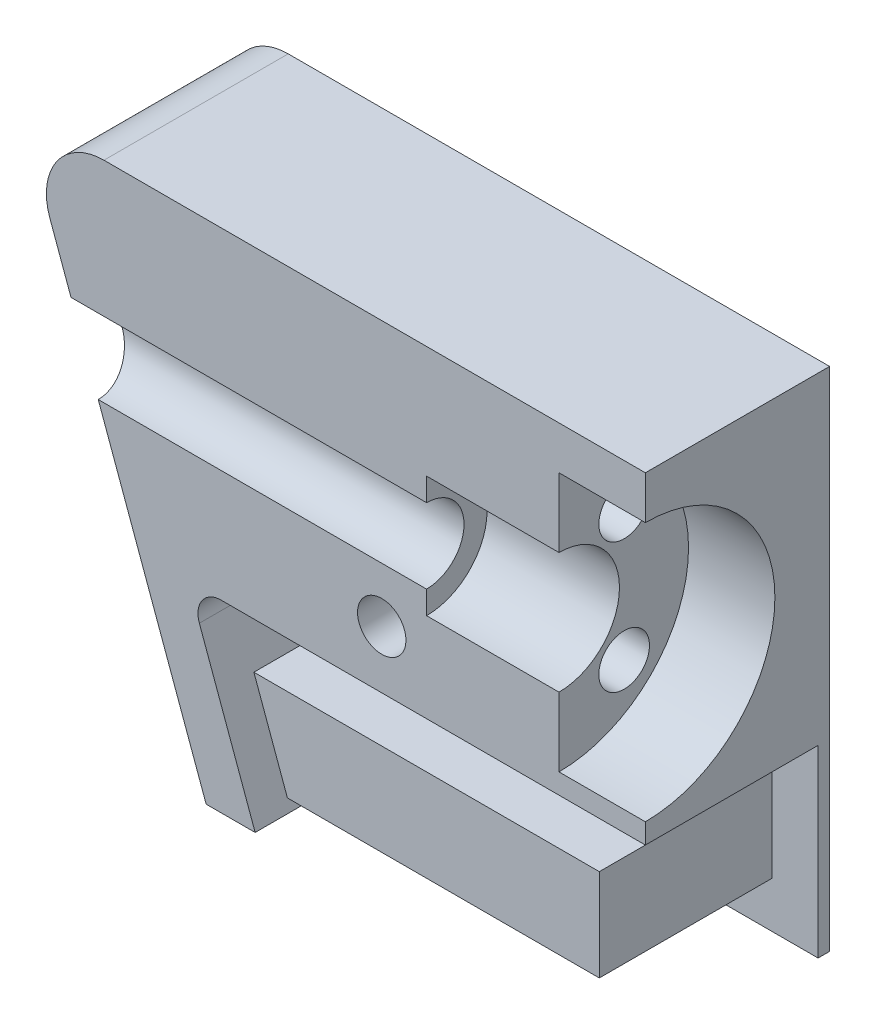
ISO-10303-21;
HEADER;
FILE_DESCRIPTION(('STEP AP214'),'2;1');
FILE_NAME('part.step','',(''),(''),'','','');
FILE_SCHEMA(('AUTOMOTIVE_DESIGN { 1 0 10303 214 1 1 1 1 }'));
ENDSEC;
DATA;
#1=APPLICATION_CONTEXT('core data for automotive mechanical design processes');
#2=APPLICATION_PROTOCOL_DEFINITION('international standard','automotive_design',2000,#1);
#3=PRODUCT_CONTEXT('',#1,'mechanical');
#4=PRODUCT('Part','Part','',(#3));
#5=PRODUCT_RELATED_PRODUCT_CATEGORY('part','',(#4));
#6=PRODUCT_DEFINITION_FORMATION('','',#4);
#7=PRODUCT_DEFINITION_CONTEXT('part definition',#1,'design');
#8=PRODUCT_DEFINITION('design','',#6,#7);
#9=PRODUCT_DEFINITION_SHAPE('','',#8);
#10=(LENGTH_UNIT() NAMED_UNIT(*) SI_UNIT(.MILLI.,.METRE.));
#11=(NAMED_UNIT(*) PLANE_ANGLE_UNIT() SI_UNIT($,.RADIAN.));
#12=(NAMED_UNIT(*) SI_UNIT($,.STERADIAN.) SOLID_ANGLE_UNIT());
#13=UNCERTAINTY_MEASURE_WITH_UNIT(LENGTH_MEASURE(1.E-05),#10,'distance_accuracy_value','');
#14=(GEOMETRIC_REPRESENTATION_CONTEXT(3) GLOBAL_UNCERTAINTY_ASSIGNED_CONTEXT((#13)) GLOBAL_UNIT_ASSIGNED_CONTEXT((#10,
#11,#12)) REPRESENTATION_CONTEXT('',''));
#15=CARTESIAN_POINT('',(0.,0.,0.));
#16=DIRECTION('',(0.,0.,1.));
#17=DIRECTION('',(1.,0.,0.));
#18=AXIS2_PLACEMENT_3D('',#15,#16,#17);
#19=CARTESIAN_POINT('',(11.1054228558984,9.,-18.));
#20=DIRECTION('',(0.,0.,1.));
#21=DIRECTION('',(-1.,0.,0.));
#22=AXIS2_PLACEMENT_3D('',#19,#20,#21);
#23=CYLINDRICAL_SURFACE('',#22,2.1);
#24=CARTESIAN_POINT('',(11.1054228558984,9.,0.));
#25=DIRECTION('',(0.,0.,-1.));
#26=DIRECTION('',(-1.,0.,0.));
#27=AXIS2_PLACEMENT_3D('',#24,#25,#26);
#28=CIRCLE('',#27,2.1);
#29=CARTESIAN_POINT('',(9.00542285589842,9.,0.));
#30=VERTEX_POINT('',#29);
#31=EDGE_CURVE('E276',#30,#30,#28,.T.);
#32=ORIENTED_EDGE('',*,*,#31,.F.);
#33=EDGE_LOOP('',(#32));
#34=FACE_BOUND('',#33,.T.);
#35=CARTESIAN_POINT('',(11.1054228558984,9.,-10.));
#36=DIRECTION('',(0.,0.,-1.));
#37=DIRECTION('',(-1.,0.,0.));
#38=AXIS2_PLACEMENT_3D('',#35,#36,#37);
#39=CIRCLE('',#38,2.1);
#40=CARTESIAN_POINT('',(9.00542285589842,9.,-10.));
#41=VERTEX_POINT('',#40);
#42=EDGE_CURVE('E41',#41,#41,#39,.F.);
#43=ORIENTED_EDGE('',*,*,#42,.F.);
#44=EDGE_LOOP('',(#43));
#45=FACE_BOUND('',#44,.T.);
#46=ADVANCED_FACE('F37',(#34,#45),#23,.F.);
#47=CARTESIAN_POINT('',(-11.425184053937,8.,-18.));
#48=DIRECTION('',(0.939692620785907,0.342020143325672,0.));
#49=DIRECTION('',(-0.342020143325672,0.939692620785907,0.));
#50=AXIS2_PLACEMENT_3D('',#47,#48,#49);
#51=PLANE('',#50);
#52=DIRECTION('',(0.,0.,1.));
#53=VECTOR('',#52,1.);
#54=CARTESIAN_POINT('',(-4.14577936861283,-12.,-18.));
#55=LINE('',#54,#53);
#56=CARTESIAN_POINT('',(-4.14577936861283,-12.,-16.));
#57=VERTEX_POINT('',#56);
#58=CARTESIAN_POINT('',(-4.14577936861283,-12.,0.));
#59=VERTEX_POINT('',#58);
#60=EDGE_CURVE('E320',#57,#59,#55,.T.);
#61=ORIENTED_EDGE('',*,*,#60,.T.);
#62=DIRECTION('',(-0.342020143325672,0.939692620785907,0.));
#63=VECTOR('',#62,1.);
#64=CARTESIAN_POINT('',(-2.689898431548,-16.,0.));
#65=LINE('',#64,#63);
#66=CARTESIAN_POINT('',(-13.5180129009677,13.75,0.));
#67=VERTEX_POINT('',#66);
#68=EDGE_CURVE('E342',#59,#67,#65,.T.);
#69=ORIENTED_EDGE('',*,*,#68,.T.);
#70=CARTESIAN_POINT('',(-14.7009161623328,17.,0.));
#71=DIRECTION('',(-0.939692620785907,-0.342020143325672,0.));
#72=DIRECTION('',(0.342020143325672,-0.939692620785907,0.));
#73=AXIS2_PLACEMENT_3D('',#70,#71,#72);
#74=ELLIPSE('',#73,3.45857776054672,3.25);
#75=CARTESIAN_POINT('',(-15.883819423698,20.25,0.));
#76=VERTEX_POINT('',#75);
#77=EDGE_CURVE('E309',#67,#76,#74,.F.);
#78=ORIENTED_EDGE('',*,*,#77,.T.);
#79=CARTESIAN_POINT('',(-17.7181927465449,25.2898992833716,0.));
#80=VERTEX_POINT('',#79);
#81=EDGE_CURVE('E341',#76,#80,#65,.T.);
#82=ORIENTED_EDGE('',*,*,#81,.T.);
#83=DIRECTION('',(0.,0.,1.));
#84=VECTOR('',#83,1.);
#85=CARTESIAN_POINT('',(-17.7181927465449,25.2898992833716,0.));
#86=LINE('',#85,#84);
#87=CARTESIAN_POINT('',(-17.7181927465449,25.2898992833716,-16.));
#88=VERTEX_POINT('',#87);
#89=EDGE_CURVE('E418',#88,#80,#86,.T.);
#90=ORIENTED_EDGE('',*,*,#89,.F.);
#91=DIRECTION('',(-0.342020143325672,0.939692620785907,0.));
#92=VECTOR('',#91,1.);
#93=CARTESIAN_POINT('',(-11.425184053937,8.,-16.));
#94=LINE('',#93,#92);
#95=EDGE_CURVE('E447',#57,#88,#94,.T.);
#96=ORIENTED_EDGE('',*,*,#95,.F.);
#97=EDGE_LOOP('',(#61,#69,#78,#82,#90,#96));
#98=FACE_BOUND('',#97,.T.);
#99=ADVANCED_FACE('F475',(#98),#51,.F.);
#100=CARTESIAN_POINT('',(0.,0.,0.));
#101=DIRECTION('',(0.,0.,1.));
#102=DIRECTION('',(-1.,0.,0.));
#103=AXIS2_PLACEMENT_3D('',#100,#101,#102);
#104=PLANE('',#103);
#105=ORIENTED_EDGE('',*,*,#81,.F.);
#106=DIRECTION('',(1.,0.,0.));
#107=VECTOR('',#106,1.);
#108=CARTESIAN_POINT('',(34.,20.25,0.));
#109=LINE('',#108,#107);
#110=CARTESIAN_POINT('',(15.,20.25,0.));
#111=VERTEX_POINT('',#110);
#112=EDGE_CURVE('E412',#111,#76,#109,.F.);
#113=ORIENTED_EDGE('',*,*,#112,.F.);
#114=DIRECTION('',(0.,-1.,0.));
#115=VECTOR('',#114,1.);
#116=CARTESIAN_POINT('',(15.,0.,0.));
#117=LINE('',#116,#115);
#118=CARTESIAN_POINT('',(15.,22.25,0.));
#119=VERTEX_POINT('',#118);
#120=EDGE_CURVE('E406',#119,#111,#117,.T.);
#121=ORIENTED_EDGE('',*,*,#120,.F.);
#122=DIRECTION('',(1.,0.,0.));
#123=VECTOR('',#122,1.);
#124=CARTESIAN_POINT('',(34.,22.25,0.));
#125=LINE('',#124,#123);
#126=CARTESIAN_POINT('',(26.5,22.25,0.));
#127=VERTEX_POINT('',#126);
#128=EDGE_CURVE('E415',#127,#119,#125,.F.);
#129=ORIENTED_EDGE('',*,*,#128,.F.);
#130=DIRECTION('',(0.,-1.,0.));
#131=VECTOR('',#130,1.);
#132=CARTESIAN_POINT('',(26.5,0.,0.));
#133=LINE('',#132,#131);
#134=CARTESIAN_POINT('',(26.5,28.25,0.));
#135=VERTEX_POINT('',#134);
#136=EDGE_CURVE('E413',#135,#127,#133,.T.);
#137=ORIENTED_EDGE('',*,*,#136,.F.);
#138=DIRECTION('',(1.,0.,0.));
#139=VECTOR('',#138,1.);
#140=CARTESIAN_POINT('',(34.,28.25,0.));
#141=LINE('',#140,#139);
#142=CARTESIAN_POINT('',(34.,28.25,0.));
#143=VERTEX_POINT('',#142);
#144=EDGE_CURVE('E306',#143,#135,#141,.F.);
#145=ORIENTED_EDGE('',*,*,#144,.F.);
#146=DIRECTION('',(0.,1.,0.));
#147=VECTOR('',#146,1.);
#148=CARTESIAN_POINT('',(34.,0.,0.));
#149=LINE('',#148,#147);
#150=CARTESIAN_POINT('',(34.,32.,0.));
#151=VERTEX_POINT('',#150);
#152=EDGE_CURVE('E385',#143,#151,#149,.T.);
#153=ORIENTED_EDGE('',*,*,#152,.T.);
#154=DIRECTION('',(1.,0.,0.));
#155=VECTOR('',#154,1.);
#156=CARTESIAN_POINT('',(-20.1604696763259,32.,0.));
#157=LINE('',#156,#155);
#158=CARTESIAN_POINT('',(-13.0197296426153,32.,0.));
#159=VERTEX_POINT('',#158);
#160=EDGE_CURVE('E312',#159,#151,#157,.T.);
#161=ORIENTED_EDGE('',*,*,#160,.F.);
#162=CARTESIAN_POINT('',(-13.0197296426153,27.,0.));
#163=DIRECTION('',(0.,0.,-1.));
#164=DIRECTION('',(-1.,0.,0.));
#165=AXIS2_PLACEMENT_3D('',#162,#163,#164);
#166=CIRCLE('',#165,5.);
#167=EDGE_CURVE('E421',#80,#159,#166,.T.);
#168=ORIENTED_EDGE('',*,*,#167,.F.);
#169=EDGE_LOOP('',(#105,#113,#121,#129,#137,#145,#153,#161,#168));
#170=FACE_BOUND('',#169,.T.);
#171=ADVANCED_FACE('F493',(#170),#104,.T.);
#172=ORIENTED_EDGE('',*,*,#31,.T.);
#173=EDGE_LOOP('',(#172));
#174=FACE_BOUND('',#173,.T.);
#175=CARTESIAN_POINT('',(26.5,11.75,0.));
#176=VERTEX_POINT('',#175);
#177=CARTESIAN_POINT('',(26.5,5.75,0.));
#178=VERTEX_POINT('',#177);
#179=EDGE_CURVE('E409',#176,#178,#133,.T.);
#180=ORIENTED_EDGE('',*,*,#179,.F.);
#181=DIRECTION('',(1.,0.,0.));
#182=VECTOR('',#181,1.);
#183=CARTESIAN_POINT('',(34.,11.75,0.));
#184=LINE('',#183,#182);
#185=CARTESIAN_POINT('',(15.,11.75,0.));
#186=VERTEX_POINT('',#185);
#187=EDGE_CURVE('E405',#186,#176,#184,.T.);
#188=ORIENTED_EDGE('',*,*,#187,.F.);
#189=CARTESIAN_POINT('',(15.,13.75,0.));
#190=VERTEX_POINT('',#189);
#191=EDGE_CURVE('E402',#190,#186,#117,.T.);
#192=ORIENTED_EDGE('',*,*,#191,.F.);
#193=DIRECTION('',(1.,0.,0.));
#194=VECTOR('',#193,1.);
#195=CARTESIAN_POINT('',(34.,13.75,0.));
#196=LINE('',#195,#194);
#197=EDGE_CURVE('E399',#67,#190,#196,.T.);
#198=ORIENTED_EDGE('',*,*,#197,.F.);
#199=ORIENTED_EDGE('',*,*,#68,.F.);
#200=DIRECTION('',(1.,0.,0.));
#201=VECTOR('',#200,1.);
#202=CARTESIAN_POINT('',(34.,-12.,0.));
#203=LINE('',#202,#201);
#204=CARTESIAN_POINT('',(0.110931721290827,-12.,0.));
#205=VERTEX_POINT('',#204);
#206=EDGE_CURVE('E317',#59,#205,#203,.T.);
#207=ORIENTED_EDGE('',*,*,#206,.T.);
#208=DIRECTION('',(0.342020143325672,-0.939692620785907,0.));
#209=VECTOR('',#208,1.);
#210=CARTESIAN_POINT('',(0.110931721290824,-12.,0.));
#211=LINE('',#210,#209);
#212=CARTESIAN_POINT('',(-4.73568125505605,1.31595971334866,0.));
#213=VERTEX_POINT('',#212);
#214=EDGE_CURVE('E330',#213,#205,#211,.T.);
#215=ORIENTED_EDGE('',*,*,#214,.F.);
#216=CARTESIAN_POINT('',(-2.85629601348424,2.,0.));
#217=DIRECTION('',(0.,0.,-1.));
#218=DIRECTION('',(-1.,0.,0.));
#219=AXIS2_PLACEMENT_3D('',#216,#217,#218);
#220=CIRCLE('',#219,2.);
#221=CARTESIAN_POINT('',(-2.85629601348424,4.,0.));
#222=VERTEX_POINT('',#221);
#223=EDGE_CURVE('E396',#222,#213,#220,.F.);
#224=ORIENTED_EDGE('',*,*,#223,.F.);
#225=DIRECTION('',(-1.,0.,0.));
#226=VECTOR('',#225,1.);
#227=CARTESIAN_POINT('',(-5.71259202696848,4.,0.));
#228=LINE('',#227,#226);
#229=CARTESIAN_POINT('',(34.,4.,0.));
#230=VERTEX_POINT('',#229);
#231=EDGE_CURVE('E345',#230,#222,#228,.T.);
#232=ORIENTED_EDGE('',*,*,#231,.F.);
#233=CARTESIAN_POINT('',(34.,5.75,0.));
#234=VERTEX_POINT('',#233);
#235=EDGE_CURVE('E386',#230,#234,#149,.T.);
#236=ORIENTED_EDGE('',*,*,#235,.T.);
#237=DIRECTION('',(1.,0.,0.));
#238=VECTOR('',#237,1.);
#239=CARTESIAN_POINT('',(34.,5.75,0.));
#240=LINE('',#239,#238);
#241=EDGE_CURVE('E303',#178,#234,#240,.T.);
#242=ORIENTED_EDGE('',*,*,#241,.F.);
#243=EDGE_LOOP('',(#180,#188,#192,#198,#199,#207,#215,#224,#232,#236,#242));
#244=FACE_BOUND('',#243,.T.);
#245=ADVANCED_FACE('F483',(#174,#244),#104,.T.);
#246=CARTESIAN_POINT('',(2.91176187412966,-8.00000000000001,-15.));
#247=DIRECTION('',(0.939692620785907,0.342020143325672,0.));
#248=DIRECTION('',(-0.342020143325672,0.939692620785907,0.));
#249=AXIS2_PLACEMENT_3D('',#246,#247,#248);
#250=PLANE('',#249);
#251=DIRECTION('',(0.342020143325672,-0.939692620785907,0.));
#252=VECTOR('',#251,1.);
#253=CARTESIAN_POINT('',(2.91176187412966,-8.00000000000001,0.));
#254=LINE('',#253,#252);
#255=CARTESIAN_POINT('',(0.,0.,0.));
#256=VERTEX_POINT('',#255);
#257=CARTESIAN_POINT('',(2.91176187412966,-8.00000000000001,0.));
#258=VERTEX_POINT('',#257);
#259=EDGE_CURVE('E351',#256,#258,#254,.T.);
#260=ORIENTED_EDGE('',*,*,#259,.F.);
#261=DIRECTION('',(0.,0.,1.));
#262=VECTOR('',#261,1.);
#263=CARTESIAN_POINT('',(0.,0.,-15.));
#264=LINE('',#263,#262);
#265=CARTESIAN_POINT('',(0.,0.,-15.));
#266=VERTEX_POINT('',#265);
#267=EDGE_CURVE('E364',#266,#256,#264,.T.);
#268=ORIENTED_EDGE('',*,*,#267,.F.);
#269=DIRECTION('',(0.342020143325672,-0.939692620785907,0.));
#270=VECTOR('',#269,1.);
#271=CARTESIAN_POINT('',(2.91176187412966,-8.00000000000001,-15.));
#272=LINE('',#271,#270);
#273=CARTESIAN_POINT('',(2.91176187412966,-8.00000000000001,-15.));
#274=VERTEX_POINT('',#273);
#275=EDGE_CURVE('E352',#266,#274,#272,.T.);
#276=ORIENTED_EDGE('',*,*,#275,.T.);
#277=DIRECTION('',(0.,0.,1.));
#278=VECTOR('',#277,1.);
#279=CARTESIAN_POINT('',(2.91176187412966,-8.00000000000001,-15.));
#280=LINE('',#279,#278);
#281=EDGE_CURVE('E382',#274,#258,#280,.T.);
#282=ORIENTED_EDGE('',*,*,#281,.T.);
#283=EDGE_LOOP('',(#260,#268,#276,#282));
#284=FACE_BOUND('',#283,.T.);
#285=ADVANCED_FACE('F604',(#284),#250,.F.);
#286=CARTESIAN_POINT('',(30.,-8.,-15.));
#287=DIRECTION('',(0.,1.,0.));
#288=DIRECTION('',(-1.,0.,0.));
#289=AXIS2_PLACEMENT_3D('',#286,#287,#288);
#290=PLANE('',#289);
#291=DIRECTION('',(1.,0.,0.));
#292=VECTOR('',#291,1.);
#293=CARTESIAN_POINT('',(30.,-8.,0.));
#294=LINE('',#293,#292);
#295=CARTESIAN_POINT('',(30.,-8.,0.));
#296=VERTEX_POINT('',#295);
#297=EDGE_CURVE('E367',#258,#296,#294,.T.);
#298=ORIENTED_EDGE('',*,*,#297,.F.);
#299=ORIENTED_EDGE('',*,*,#281,.F.);
#300=DIRECTION('',(1.,0.,0.));
#301=VECTOR('',#300,1.);
#302=CARTESIAN_POINT('',(30.,-8.,-15.));
#303=LINE('',#302,#301);
#304=CARTESIAN_POINT('',(30.,-8.,-15.));
#305=VERTEX_POINT('',#304);
#306=EDGE_CURVE('E355',#274,#305,#303,.T.);
#307=ORIENTED_EDGE('',*,*,#306,.T.);
#308=DIRECTION('',(0.,0.,1.));
#309=VECTOR('',#308,1.);
#310=CARTESIAN_POINT('',(30.,-8.,-15.));
#311=LINE('',#310,#309);
#312=EDGE_CURVE('E379',#305,#296,#311,.T.);
#313=ORIENTED_EDGE('',*,*,#312,.T.);
#314=EDGE_LOOP('',(#298,#299,#307,#313));
#315=FACE_BOUND('',#314,.T.);
#316=ADVANCED_FACE('F600',(#315),#290,.F.);
#317=CARTESIAN_POINT('',(30.,0.,-15.));
#318=DIRECTION('',(-1.,0.,0.));
#319=DIRECTION('',(0.,0.,-1.));
#320=AXIS2_PLACEMENT_3D('',#317,#318,#319);
#321=PLANE('',#320);
#322=DIRECTION('',(0.,1.,0.));
#323=VECTOR('',#322,1.);
#324=CARTESIAN_POINT('',(30.,0.,0.));
#325=LINE('',#324,#323);
#326=CARTESIAN_POINT('',(30.,0.,0.));
#327=VERTEX_POINT('',#326);
#328=EDGE_CURVE('E370',#296,#327,#325,.T.);
#329=ORIENTED_EDGE('',*,*,#328,.F.);
#330=ORIENTED_EDGE('',*,*,#312,.F.);
#331=DIRECTION('',(0.,1.,0.));
#332=VECTOR('',#331,1.);
#333=CARTESIAN_POINT('',(30.,0.,-15.));
#334=LINE('',#333,#332);
#335=CARTESIAN_POINT('',(30.,0.,-15.));
#336=VERTEX_POINT('',#335);
#337=EDGE_CURVE('E359',#305,#336,#334,.T.);
#338=ORIENTED_EDGE('',*,*,#337,.T.);
#339=DIRECTION('',(0.,0.,1.));
#340=VECTOR('',#339,1.);
#341=CARTESIAN_POINT('',(30.,0.,-15.));
#342=LINE('',#341,#340);
#343=EDGE_CURVE('E376',#336,#327,#342,.T.);
#344=ORIENTED_EDGE('',*,*,#343,.T.);
#345=EDGE_LOOP('',(#329,#330,#338,#344));
#346=FACE_BOUND('',#345,.T.);
#347=ADVANCED_FACE('F596',(#346),#321,.F.);
#348=CARTESIAN_POINT('',(0.,0.,-15.));
#349=DIRECTION('',(0.,-1.,0.));
#350=DIRECTION('',(0.,0.,1.));
#351=AXIS2_PLACEMENT_3D('',#348,#349,#350);
#352=PLANE('',#351);
#353=DIRECTION('',(-1.,0.,0.));
#354=VECTOR('',#353,1.);
#355=CARTESIAN_POINT('',(0.,0.,0.));
#356=LINE('',#355,#354);
#357=EDGE_CURVE('E356',#327,#256,#356,.T.);
#358=ORIENTED_EDGE('',*,*,#357,.F.);
#359=ORIENTED_EDGE('',*,*,#343,.F.);
#360=DIRECTION('',(-1.,0.,0.));
#361=VECTOR('',#360,1.);
#362=CARTESIAN_POINT('',(0.,0.,-15.));
#363=LINE('',#362,#361);
#364=EDGE_CURVE('E362',#336,#266,#363,.T.);
#365=ORIENTED_EDGE('',*,*,#364,.T.);
#366=ORIENTED_EDGE('',*,*,#267,.T.);
#367=EDGE_LOOP('',(#358,#359,#365,#366));
#368=FACE_BOUND('',#367,.T.);
#369=ADVANCED_FACE('F592',(#368),#352,.F.);
#370=CARTESIAN_POINT('',(0.,0.,0.));
#371=DIRECTION('',(0.,0.,1.));
#372=DIRECTION('',(-1.,0.,0.));
#373=AXIS2_PLACEMENT_3D('',#370,#371,#372);
#374=PLANE('',#373);
#375=ORIENTED_EDGE('',*,*,#259,.T.);
#376=ORIENTED_EDGE('',*,*,#297,.T.);
#377=ORIENTED_EDGE('',*,*,#328,.T.);
#378=ORIENTED_EDGE('',*,*,#357,.T.);
#379=EDGE_LOOP('',(#375,#376,#377,#378));
#380=FACE_BOUND('',#379,.T.);
#381=ADVANCED_FACE('F585',(#380),#374,.T.);
#382=CARTESIAN_POINT('',(0.,0.,-18.));
#383=DIRECTION('',(0.,0.,1.));
#384=DIRECTION('',(-1.,0.,0.));
#385=AXIS2_PLACEMENT_3D('',#382,#383,#384);
#386=PLANE('',#385);
#387=DIRECTION('',(1.,0.,0.));
#388=VECTOR('',#387,1.);
#389=CARTESIAN_POINT('',(8.99809437335628,12.65,-18.));
#390=LINE('',#389,#388);
#391=CARTESIAN_POINT('',(8.99809437335628,12.65,-18.));
#392=VERTEX_POINT('',#391);
#393=CARTESIAN_POINT('',(13.2127513384406,12.65,-18.));
#394=VERTEX_POINT('',#393);
#395=EDGE_CURVE('E257',#392,#394,#390,.T.);
#396=ORIENTED_EDGE('',*,*,#395,.F.);
#397=DIRECTION('',(0.5,0.866025403784439,0.));
#398=VECTOR('',#397,1.);
#399=CARTESIAN_POINT('',(6.89076589081415,9.00000000000001,-18.));
#400=LINE('',#399,#398);
#401=CARTESIAN_POINT('',(6.89076589081415,9.00000000000001,-18.));
#402=VERTEX_POINT('',#401);
#403=EDGE_CURVE('E54',#402,#392,#400,.T.);
#404=ORIENTED_EDGE('',*,*,#403,.F.);
#405=DIRECTION('',(-0.5,0.866025403784439,0.));
#406=VECTOR('',#405,1.);
#407=CARTESIAN_POINT('',(8.99809437335629,5.35,-18.));
#408=LINE('',#407,#406);
#409=CARTESIAN_POINT('',(8.99809437335629,5.35,-18.));
#410=VERTEX_POINT('',#409);
#411=EDGE_CURVE('E243',#410,#402,#408,.T.);
#412=ORIENTED_EDGE('',*,*,#411,.F.);
#413=DIRECTION('',(-1.,0.,0.));
#414=VECTOR('',#413,1.);
#415=CARTESIAN_POINT('',(13.2127513384406,5.35,-18.));
#416=LINE('',#415,#414);
#417=CARTESIAN_POINT('',(13.2127513384406,5.35,-18.));
#418=VERTEX_POINT('',#417);
#419=EDGE_CURVE('E246',#418,#410,#416,.T.);
#420=ORIENTED_EDGE('',*,*,#419,.F.);
#421=DIRECTION('',(-0.5,-0.866025403784439,0.));
#422=VECTOR('',#421,1.);
#423=CARTESIAN_POINT('',(15.3200798209827,9.,-18.));
#424=LINE('',#423,#422);
#425=CARTESIAN_POINT('',(15.3200798209827,9.,-18.));
#426=VERTEX_POINT('',#425);
#427=EDGE_CURVE('E262',#426,#418,#424,.T.);
#428=ORIENTED_EDGE('',*,*,#427,.F.);
#429=DIRECTION('',(0.5,-0.866025403784439,0.));
#430=VECTOR('',#429,1.);
#431=CARTESIAN_POINT('',(13.2127513384406,12.65,-18.));
#432=LINE('',#431,#430);
#433=EDGE_CURVE('E259',#394,#426,#432,.T.);
#434=ORIENTED_EDGE('',*,*,#433,.F.);
#435=EDGE_LOOP('',(#396,#404,#412,#420,#428,#434));
#436=FACE_BOUND('',#435,.T.);
#437=DIRECTION('',(1.,0.,0.));
#438=VECTOR('',#437,1.);
#439=CARTESIAN_POINT('',(0.,-10.,-18.));
#440=LINE('',#439,#438);
#441=CARTESIAN_POINT('',(-2.74536429219341,-10.,-18.));
#442=VERTEX_POINT('',#441);
#443=CARTESIAN_POINT('',(32.,-10.,-18.));
#444=VERTEX_POINT('',#443);
#445=EDGE_CURVE('E435',#442,#444,#440,.T.);
#446=ORIENTED_EDGE('',*,*,#445,.F.);
#447=DIRECTION('',(0.342020143325672,-0.939692620785907,0.));
#448=VECTOR('',#447,1.);
#449=CARTESIAN_POINT('',(-5.63815572471544,-2.05212085995403,-18.));
#450=LINE('',#449,#448);
#451=CARTESIAN_POINT('',(-15.838807504973,25.973939570023,-18.));
#452=VERTEX_POINT('',#451);
#453=EDGE_CURVE('E432',#452,#442,#450,.T.);
#454=ORIENTED_EDGE('',*,*,#453,.F.);
#455=CARTESIAN_POINT('',(-13.0197296426153,27.,-18.));
#456=DIRECTION('',(0.,0.,-1.));
#457=DIRECTION('',(-1.,0.,0.));
#458=AXIS2_PLACEMENT_3D('',#455,#456,#457);
#459=CIRCLE('',#458,3.);
#460=CARTESIAN_POINT('',(-13.0197296426153,30.,-18.));
#461=VERTEX_POINT('',#460);
#462=EDGE_CURVE('E429',#461,#452,#459,.F.);
#463=ORIENTED_EDGE('',*,*,#462,.F.);
#464=DIRECTION('',(-1.,0.,0.));
#465=VECTOR('',#464,1.);
#466=CARTESIAN_POINT('',(-13.0197296426153,30.,-18.));
#467=LINE('',#466,#465);
#468=CARTESIAN_POINT('',(32.,30.,-18.));
#469=VERTEX_POINT('',#468);
#470=EDGE_CURVE('E427',#469,#461,#467,.T.);
#471=ORIENTED_EDGE('',*,*,#470,.F.);
#472=DIRECTION('',(0.,1.,0.));
#473=VECTOR('',#472,1.);
#474=CARTESIAN_POINT('',(32.,0.,-18.));
#475=LINE('',#474,#473);
#476=EDGE_CURVE('E438',#444,#469,#475,.T.);
#477=ORIENTED_EDGE('',*,*,#476,.F.);
#478=EDGE_LOOP('',(#446,#454,#463,#471,#477));
#479=FACE_BOUND('',#478,.T.);
#480=ADVANCED_FACE('F467',(#436,#479),#386,.F.);
#481=CARTESIAN_POINT('',(0.,0.,-15.));
#482=DIRECTION('',(0.,0.,1.));
#483=DIRECTION('',(-1.,0.,0.));
#484=AXIS2_PLACEMENT_3D('',#481,#482,#483);
#485=PLANE('',#484);
#486=DIRECTION('',(-0.342020143325672,0.939692620785907,0.));
#487=VECTOR('',#486,1.);
#488=CARTESIAN_POINT('',(0.110931721290824,-12.,-15.));
#489=LINE('',#488,#487);
#490=CARTESIAN_POINT('',(0.110931721290824,-12.,-15.));
#491=VERTEX_POINT('',#490);
#492=CARTESIAN_POINT('',(-4.73568125505605,1.31595971334866,-15.));
#493=VERTEX_POINT('',#492);
#494=EDGE_CURVE('E338',#491,#493,#489,.T.);
#495=ORIENTED_EDGE('',*,*,#494,.F.);
#496=DIRECTION('',(1.,0.,0.));
#497=VECTOR('',#496,1.);
#498=CARTESIAN_POINT('',(0.,-12.,-15.));
#499=LINE('',#498,#497);
#500=CARTESIAN_POINT('',(34.,-12.,-15.));
#501=VERTEX_POINT('',#500);
#502=EDGE_CURVE('E327',#491,#501,#499,.T.);
#503=ORIENTED_EDGE('',*,*,#502,.T.);
#504=DIRECTION('',(0.,-1.,0.));
#505=VECTOR('',#504,1.);
#506=CARTESIAN_POINT('',(34.,4.,-15.));
#507=LINE('',#506,#505);
#508=CARTESIAN_POINT('',(34.,4.,-15.));
#509=VERTEX_POINT('',#508);
#510=EDGE_CURVE('E331',#509,#501,#507,.T.);
#511=ORIENTED_EDGE('',*,*,#510,.F.);
#512=DIRECTION('',(1.,0.,0.));
#513=VECTOR('',#512,1.);
#514=CARTESIAN_POINT('',(-5.71259202696848,4.,-15.));
#515=LINE('',#514,#513);
#516=CARTESIAN_POINT('',(-2.85629601348424,4.,-15.));
#517=VERTEX_POINT('',#516);
#518=EDGE_CURVE('E334',#517,#509,#515,.T.);
#519=ORIENTED_EDGE('',*,*,#518,.F.);
#520=CARTESIAN_POINT('',(-2.85629601348424,2.,-15.));
#521=DIRECTION('',(0.,0.,-1.));
#522=DIRECTION('',(-1.,0.,0.));
#523=AXIS2_PLACEMENT_3D('',#520,#521,#522);
#524=CIRCLE('',#523,2.);
#525=EDGE_CURVE('E393',#493,#517,#524,.T.);
#526=ORIENTED_EDGE('',*,*,#525,.F.);
#527=EDGE_LOOP('',(#495,#503,#511,#519,#526));
#528=FACE_BOUND('',#527,.T.);
#529=ORIENTED_EDGE('',*,*,#364,.F.);
#530=ORIENTED_EDGE('',*,*,#337,.F.);
#531=ORIENTED_EDGE('',*,*,#306,.F.);
#532=ORIENTED_EDGE('',*,*,#275,.F.);
#533=EDGE_LOOP('',(#529,#530,#531,#532));
#534=FACE_BOUND('',#533,.T.);
#535=ADVANCED_FACE('F578',(#528,#534),#485,.T.);
#536=CARTESIAN_POINT('',(-5.71259202696848,4.,-69.944051714135));
#537=DIRECTION('',(0.,-1.,0.));
#538=DIRECTION('',(0.,0.,1.));
#539=AXIS2_PLACEMENT_3D('',#536,#537,#538);
#540=PLANE('',#539);
#541=ORIENTED_EDGE('',*,*,#518,.T.);
#542=DIRECTION('',(0.,0.,1.));
#543=VECTOR('',#542,1.);
#544=CARTESIAN_POINT('',(34.,4.,-69.944051714135));
#545=LINE('',#544,#543);
#546=EDGE_CURVE('E335',#509,#230,#545,.T.);
#547=ORIENTED_EDGE('',*,*,#546,.T.);
#548=ORIENTED_EDGE('',*,*,#231,.T.);
#549=DIRECTION('',(0.,0.,1.));
#550=VECTOR('',#549,1.);
#551=CARTESIAN_POINT('',(-2.85629601348424,4.,0.));
#552=LINE('',#551,#550);
#553=EDGE_CURVE('E389',#517,#222,#552,.T.);
#554=ORIENTED_EDGE('',*,*,#553,.F.);
#555=EDGE_LOOP('',(#541,#547,#548,#554));
#556=FACE_BOUND('',#555,.T.);
#557=ADVANCED_FACE('F575',(#556),#540,.T.);
#558=CARTESIAN_POINT('',(0.110931721290824,-12.,-69.944051714135));
#559=DIRECTION('',(0.939692620785907,0.342020143325672,0.));
#560=DIRECTION('',(-0.342020143325672,0.939692620785907,0.));
#561=AXIS2_PLACEMENT_3D('',#558,#559,#560);
#562=PLANE('',#561);
#563=ORIENTED_EDGE('',*,*,#214,.T.);
#564=DIRECTION('',(0.,0.,-1.));
#565=VECTOR('',#564,1.);
#566=CARTESIAN_POINT('',(0.110931721290824,-12.,-69.944051714135));
#567=LINE('',#566,#565);
#568=EDGE_CURVE('E323',#205,#491,#567,.T.);
#569=ORIENTED_EDGE('',*,*,#568,.T.);
#570=ORIENTED_EDGE('',*,*,#494,.T.);
#571=DIRECTION('',(0.,0.,1.));
#572=VECTOR('',#571,1.);
#573=CARTESIAN_POINT('',(-4.73568125505605,1.31595971334866,-15.));
#574=LINE('',#573,#572);
#575=EDGE_CURVE('E391',#213,#493,#574,.F.);
#576=ORIENTED_EDGE('',*,*,#575,.F.);
#577=EDGE_LOOP('',(#563,#569,#570,#576));
#578=FACE_BOUND('',#577,.T.);
#579=ADVANCED_FACE('F570',(#578),#562,.T.);
#580=CARTESIAN_POINT('',(34.,8.,-18.));
#581=DIRECTION('',(-1.,0.,0.));
#582=DIRECTION('',(0.,0.,-1.));
#583=AXIS2_PLACEMENT_3D('',#580,#581,#582);
#584=PLANE('',#583);
#585=DIRECTION('',(0.,0.,1.));
#586=VECTOR('',#585,1.);
#587=CARTESIAN_POINT('',(34.,32.,-77.239821704325));
#588=LINE('',#587,#586);
#589=CARTESIAN_POINT('',(34.,32.,-16.));
#590=VERTEX_POINT('',#589);
#591=EDGE_CURVE('E315',#590,#151,#588,.T.);
#592=ORIENTED_EDGE('',*,*,#591,.T.);
#593=ORIENTED_EDGE('',*,*,#152,.F.);
#594=CARTESIAN_POINT('',(34.,17.,0.));
#595=DIRECTION('',(-1.,0.,0.));
#596=DIRECTION('',(0.,0.,1.));
#597=AXIS2_PLACEMENT_3D('',#594,#595,#596);
#598=CIRCLE('',#597,11.25);
#599=EDGE_CURVE('E301',#143,#234,#598,.T.);
#600=ORIENTED_EDGE('',*,*,#599,.T.);
#601=ORIENTED_EDGE('',*,*,#235,.F.);
#602=ORIENTED_EDGE('',*,*,#546,.F.);
#603=ORIENTED_EDGE('',*,*,#510,.T.);
#604=DIRECTION('',(0.,0.,1.));
#605=VECTOR('',#604,1.);
#606=CARTESIAN_POINT('',(34.,-12.,-18.));
#607=LINE('',#606,#605);
#608=CARTESIAN_POINT('',(34.,-12.,-16.));
#609=VERTEX_POINT('',#608);
#610=EDGE_CURVE('E321',#609,#501,#607,.T.);
#611=ORIENTED_EDGE('',*,*,#610,.F.);
#612=DIRECTION('',(0.,-1.,0.));
#613=VECTOR('',#612,1.);
#614=CARTESIAN_POINT('',(34.,8.,-16.));
#615=LINE('',#614,#613);
#616=EDGE_CURVE('E441',#590,#609,#615,.T.);
#617=ORIENTED_EDGE('',*,*,#616,.F.);
#618=EDGE_LOOP('',(#592,#593,#600,#601,#602,#603,#611,#617));
#619=FACE_BOUND('',#618,.T.);
#620=ADVANCED_FACE('F506',(#619),#584,.F.);
#621=CARTESIAN_POINT('',(34.,-12.,-18.));
#622=DIRECTION('',(0.,1.,0.));
#623=DIRECTION('',(0.,0.,-1.));
#624=AXIS2_PLACEMENT_3D('',#621,#622,#623);
#625=PLANE('',#624);
#626=ORIENTED_EDGE('',*,*,#610,.T.);
#627=ORIENTED_EDGE('',*,*,#502,.F.);
#628=ORIENTED_EDGE('',*,*,#568,.F.);
#629=ORIENTED_EDGE('',*,*,#206,.F.);
#630=ORIENTED_EDGE('',*,*,#60,.F.);
#631=DIRECTION('',(-1.,0.,0.));
#632=VECTOR('',#631,1.);
#633=CARTESIAN_POINT('',(34.,-12.,-16.));
#634=LINE('',#633,#632);
#635=EDGE_CURVE('E444',#609,#57,#634,.T.);
#636=ORIENTED_EDGE('',*,*,#635,.F.);
#637=EDGE_LOOP('',(#626,#627,#628,#629,#630,#636));
#638=FACE_BOUND('',#637,.T.);
#639=ADVANCED_FACE('F477',(#638),#625,.F.);
#640=CARTESIAN_POINT('',(-2.85629601348424,2.,-69.944051714135));
#641=DIRECTION('',(0.,0.,-1.));
#642=DIRECTION('',(1.,0.,0.));
#643=AXIS2_PLACEMENT_3D('',#640,#641,#642);
#644=CYLINDRICAL_SURFACE('',#643,2.);
#645=ORIENTED_EDGE('',*,*,#525,.T.);
#646=ORIENTED_EDGE('',*,*,#553,.T.);
#647=ORIENTED_EDGE('',*,*,#223,.T.);
#648=ORIENTED_EDGE('',*,*,#575,.T.);
#649=EDGE_LOOP('',(#645,#646,#647,#648));
#650=FACE_BOUND('',#649,.T.);
#651=ADVANCED_FACE('F567',(#650),#644,.F.);
#652=CARTESIAN_POINT('',(-20.1604696763259,32.,-77.239821704325));
#653=DIRECTION('',(0.,1.,0.));
#654=DIRECTION('',(-1.,0.,0.));
#655=AXIS2_PLACEMENT_3D('',#652,#653,#654);
#656=PLANE('',#655);
#657=DIRECTION('',(0.,0.,1.));
#658=VECTOR('',#657,1.);
#659=CARTESIAN_POINT('',(-13.0197296426153,32.,-18.));
#660=LINE('',#659,#658);
#661=CARTESIAN_POINT('',(-13.0197296426153,32.,-16.));
#662=VERTEX_POINT('',#661);
#663=EDGE_CURVE('E424',#159,#662,#660,.F.);
#664=ORIENTED_EDGE('',*,*,#663,.F.);
#665=ORIENTED_EDGE('',*,*,#160,.T.);
#666=ORIENTED_EDGE('',*,*,#591,.F.);
#667=DIRECTION('',(1.,0.,0.));
#668=VECTOR('',#667,1.);
#669=CARTESIAN_POINT('',(34.,32.,-16.));
#670=LINE('',#669,#668);
#671=EDGE_CURVE('E12',#662,#590,#670,.T.);
#672=ORIENTED_EDGE('',*,*,#671,.F.);
#673=EDGE_LOOP('',(#664,#665,#666,#672));
#674=FACE_BOUND('',#673,.T.);
#675=ADVANCED_FACE('F501',(#674),#656,.T.);
#676=CARTESIAN_POINT('',(34.,17.,0.));
#677=DIRECTION('',(1.,0.,0.));
#678=DIRECTION('',(0.,0.,1.));
#679=AXIS2_PLACEMENT_3D('',#676,#677,#678);
#680=CYLINDRICAL_SURFACE('',#679,11.25);
#681=ORIENTED_EDGE('',*,*,#599,.F.);
#682=ORIENTED_EDGE('',*,*,#144,.T.);
#683=CARTESIAN_POINT('',(26.5,17.,0.));
#684=DIRECTION('',(-1.,0.,0.));
#685=DIRECTION('',(0.,0.,1.));
#686=AXIS2_PLACEMENT_3D('',#683,#684,#685);
#687=CIRCLE('',#686,11.25);
#688=EDGE_CURVE('E299',#135,#178,#687,.T.);
#689=ORIENTED_EDGE('',*,*,#688,.T.);
#690=ORIENTED_EDGE('',*,*,#241,.T.);
#691=EDGE_LOOP('',(#681,#682,#689,#690));
#692=FACE_BOUND('',#691,.T.);
#693=ADVANCED_FACE('F560',(#692),#680,.F.);
#694=CARTESIAN_POINT('',(26.5,28.25,0.));
#695=DIRECTION('',(1.,0.,0.));
#696=DIRECTION('',(0.,0.,1.));
#697=AXIS2_PLACEMENT_3D('',#694,#695,#696);
#698=PLANE('',#697);
#699=CARTESIAN_POINT('',(26.5,11.3431457505076,-5.65685424949239));
#700=DIRECTION('',(-1.,0.,0.));
#701=DIRECTION('',(0.,0.,1.));
#702=AXIS2_PLACEMENT_3D('',#699,#700,#701);
#703=CIRCLE('',#702,2.2);
#704=CARTESIAN_POINT('',(26.5,11.3431457505076,-3.45685424949239));
#705=VERTEX_POINT('',#704);
#706=EDGE_CURVE('E284',#705,#705,#703,.T.);
#707=ORIENTED_EDGE('',*,*,#706,.T.);
#708=EDGE_LOOP('',(#707));
#709=FACE_BOUND('',#708,.T.);
#710=CARTESIAN_POINT('',(26.5,22.6568542494924,-5.65685424949237));
#711=DIRECTION('',(-1.,0.,0.));
#712=DIRECTION('',(0.,0.,1.));
#713=AXIS2_PLACEMENT_3D('',#710,#711,#712);
#714=CIRCLE('',#713,2.2);
#715=CARTESIAN_POINT('',(26.5,22.6568542494924,-3.45685424949237));
#716=VERTEX_POINT('',#715);
#717=EDGE_CURVE('E283',#716,#716,#714,.T.);
#718=ORIENTED_EDGE('',*,*,#717,.T.);
#719=EDGE_LOOP('',(#718));
#720=FACE_BOUND('',#719,.T.);
#721=ORIENTED_EDGE('',*,*,#688,.F.);
#722=ORIENTED_EDGE('',*,*,#136,.T.);
#723=CARTESIAN_POINT('',(26.5,17.,0.));
#724=DIRECTION('',(-1.,0.,0.));
#725=DIRECTION('',(0.,0.,1.));
#726=AXIS2_PLACEMENT_3D('',#723,#724,#725);
#727=CIRCLE('',#726,5.25);
#728=EDGE_CURVE('E297',#127,#176,#727,.T.);
#729=ORIENTED_EDGE('',*,*,#728,.T.);
#730=ORIENTED_EDGE('',*,*,#179,.T.);
#731=EDGE_LOOP('',(#721,#722,#729,#730));
#732=FACE_BOUND('',#731,.T.);
#733=ADVANCED_FACE('F556',(#709,#720,#732),#698,.T.);
#734=CARTESIAN_POINT('',(34.,17.,0.));
#735=DIRECTION('',(1.,0.,0.));
#736=DIRECTION('',(0.,0.,1.));
#737=AXIS2_PLACEMENT_3D('',#734,#735,#736);
#738=CYLINDRICAL_SURFACE('',#737,5.25);
#739=ORIENTED_EDGE('',*,*,#728,.F.);
#740=ORIENTED_EDGE('',*,*,#128,.T.);
#741=CARTESIAN_POINT('',(15.,17.,0.));
#742=DIRECTION('',(-1.,0.,0.));
#743=DIRECTION('',(0.,0.,1.));
#744=AXIS2_PLACEMENT_3D('',#741,#742,#743);
#745=CIRCLE('',#744,5.25);
#746=EDGE_CURVE('E295',#119,#186,#745,.T.);
#747=ORIENTED_EDGE('',*,*,#746,.T.);
#748=ORIENTED_EDGE('',*,*,#187,.T.);
#749=EDGE_LOOP('',(#739,#740,#747,#748));
#750=FACE_BOUND('',#749,.T.);
#751=ADVANCED_FACE('F552',(#750),#738,.F.);
#752=CARTESIAN_POINT('',(15.,22.25,0.));
#753=DIRECTION('',(1.,0.,0.));
#754=DIRECTION('',(0.,0.,1.));
#755=AXIS2_PLACEMENT_3D('',#752,#753,#754);
#756=PLANE('',#755);
#757=ORIENTED_EDGE('',*,*,#746,.F.);
#758=ORIENTED_EDGE('',*,*,#120,.T.);
#759=CARTESIAN_POINT('',(15.,17.,0.));
#760=DIRECTION('',(-1.,0.,0.));
#761=DIRECTION('',(0.,0.,1.));
#762=AXIS2_PLACEMENT_3D('',#759,#760,#761);
#763=CIRCLE('',#762,3.25);
#764=EDGE_CURVE('E291',#111,#190,#763,.T.);
#765=ORIENTED_EDGE('',*,*,#764,.T.);
#766=ORIENTED_EDGE('',*,*,#191,.T.);
#767=EDGE_LOOP('',(#757,#758,#765,#766));
#768=FACE_BOUND('',#767,.T.);
#769=ADVANCED_FACE('F549',(#768),#756,.T.);
#770=CARTESIAN_POINT('',(34.,17.,0.));
#771=DIRECTION('',(1.,0.,0.));
#772=DIRECTION('',(0.,0.,1.));
#773=AXIS2_PLACEMENT_3D('',#770,#771,#772);
#774=CYLINDRICAL_SURFACE('',#773,3.25);
#775=ORIENTED_EDGE('',*,*,#764,.F.);
#776=ORIENTED_EDGE('',*,*,#112,.T.);
#777=ORIENTED_EDGE('',*,*,#77,.F.);
#778=ORIENTED_EDGE('',*,*,#197,.T.);
#779=EDGE_LOOP('',(#775,#776,#777,#778));
#780=FACE_BOUND('',#779,.T.);
#781=ADVANCED_FACE('F488',(#780),#774,.F.);
#782=CARTESIAN_POINT('',(20.5,22.6568542494924,-5.65685424949237));
#783=DIRECTION('',(1.,0.,0.));
#784=DIRECTION('',(0.,0.,1.));
#785=AXIS2_PLACEMENT_3D('',#782,#783,#784);
#786=CYLINDRICAL_SURFACE('',#785,2.2);
#787=CARTESIAN_POINT('',(20.5,22.6568542494924,-5.65685424949237));
#788=DIRECTION('',(-1.,0.,0.));
#789=DIRECTION('',(0.,0.,1.));
#790=AXIS2_PLACEMENT_3D('',#787,#788,#789);
#791=CIRCLE('',#790,2.2);
#792=CARTESIAN_POINT('',(20.5,22.6568542494924,-3.45685424949237));
#793=VERTEX_POINT('',#792);
#794=EDGE_CURVE('E288',#793,#793,#791,.T.);
#795=ORIENTED_EDGE('',*,*,#794,.T.);
#796=EDGE_LOOP('',(#795));
#797=FACE_BOUND('',#796,.T.);
#798=ORIENTED_EDGE('',*,*,#717,.F.);
#799=EDGE_LOOP('',(#798));
#800=FACE_BOUND('',#799,.T.);
#801=ADVANCED_FACE('F542',(#797,#800),#786,.F.);
#802=CARTESIAN_POINT('',(20.5,22.6568542494924,-5.65685424949237));
#803=DIRECTION('',(1.,0.,0.));
#804=DIRECTION('',(0.,0.,1.));
#805=AXIS2_PLACEMENT_3D('',#802,#803,#804);
#806=PLANE('',#805);
#807=ORIENTED_EDGE('',*,*,#794,.F.);
#808=EDGE_LOOP('',(#807));
#809=FACE_BOUND('',#808,.T.);
#810=ADVANCED_FACE('F538',(#809),#806,.T.);
#811=CARTESIAN_POINT('',(20.5,11.3431457505076,-5.65685424949239));
#812=DIRECTION('',(1.,0.,0.));
#813=DIRECTION('',(0.,0.,1.));
#814=AXIS2_PLACEMENT_3D('',#811,#812,#813);
#815=CYLINDRICAL_SURFACE('',#814,2.2);
#816=CARTESIAN_POINT('',(20.5,11.3431457505076,-5.65685424949239));
#817=DIRECTION('',(-1.,0.,0.));
#818=DIRECTION('',(0.,0.,1.));
#819=AXIS2_PLACEMENT_3D('',#816,#817,#818);
#820=CIRCLE('',#819,2.2);
#821=CARTESIAN_POINT('',(20.5,11.3431457505076,-3.45685424949239));
#822=VERTEX_POINT('',#821);
#823=EDGE_CURVE('E280',#822,#822,#820,.T.);
#824=ORIENTED_EDGE('',*,*,#823,.T.);
#825=EDGE_LOOP('',(#824));
#826=FACE_BOUND('',#825,.T.);
#827=ORIENTED_EDGE('',*,*,#706,.F.);
#828=EDGE_LOOP('',(#827));
#829=FACE_BOUND('',#828,.T.);
#830=ADVANCED_FACE('F534',(#826,#829),#815,.F.);
#831=CARTESIAN_POINT('',(20.5,11.3431457505076,-5.65685424949239));
#832=DIRECTION('',(1.,0.,0.));
#833=DIRECTION('',(0.,0.,1.));
#834=AXIS2_PLACEMENT_3D('',#831,#832,#833);
#835=PLANE('',#834);
#836=ORIENTED_EDGE('',*,*,#823,.F.);
#837=EDGE_LOOP('',(#836));
#838=FACE_BOUND('',#837,.T.);
#839=ADVANCED_FACE('F531',(#838),#835,.T.);
#840=CARTESIAN_POINT('',(-13.0197296426153,27.,-18.));
#841=DIRECTION('',(0.,0.,-1.));
#842=DIRECTION('',(1.,0.,0.));
#843=AXIS2_PLACEMENT_3D('',#840,#841,#842);
#844=CYLINDRICAL_SURFACE('',#843,5.);
#845=ORIENTED_EDGE('',*,*,#89,.T.);
#846=ORIENTED_EDGE('',*,*,#167,.T.);
#847=ORIENTED_EDGE('',*,*,#663,.T.);
#848=CARTESIAN_POINT('',(-13.0197296426153,27.,-16.));
#849=DIRECTION('',(0.,0.,-1.));
#850=DIRECTION('',(-1.,0.,0.));
#851=AXIS2_PLACEMENT_3D('',#848,#849,#850);
#852=CIRCLE('',#851,5.);
#853=EDGE_CURVE('E46',#88,#662,#852,.T.);
#854=ORIENTED_EDGE('',*,*,#853,.F.);
#855=EDGE_LOOP('',(#845,#846,#847,#854));
#856=FACE_BOUND('',#855,.T.);
#857=ADVANCED_FACE('F497',(#856),#844,.T.);
#858=CARTESIAN_POINT('',(-5.63815572471544,-2.05212085995403,-18.));
#859=DIRECTION('',(0.664463024388673,0.241844762647978,0.707106781186548));
#860=DIRECTION('',(0.342020143325672,-0.939692620785907,0.));
#861=AXIS2_PLACEMENT_3D('',#858,#859,#860);
#862=PLANE('',#861);
#863=DIRECTION('',(0.443712606279657,0.633687274224643,-0.633687274224642));
#864=VECTOR('',#863,1.);
#865=CARTESIAN_POINT('',(-1.0801544346903,-7.62183386119961,-20.3781661388004));
#866=LINE('',#865,#864);
#867=EDGE_CURVE('E455',#442,#57,#866,.F.);
#868=ORIENTED_EDGE('',*,*,#867,.T.);
#869=ORIENTED_EDGE('',*,*,#95,.T.);
#870=DIRECTION('',(0.664463024388674,0.241844762647978,-0.707106781186548));
#871=VECTOR('',#870,1.);
#872=CARTESIAN_POINT('',(-17.7181927465449,25.2898992833716,-16.));
#873=LINE('',#872,#871);
#874=EDGE_CURVE('E287',#88,#452,#873,.T.);
#875=ORIENTED_EDGE('',*,*,#874,.T.);
#876=ORIENTED_EDGE('',*,*,#453,.T.);
#877=EDGE_LOOP('',(#868,#869,#875,#876));
#878=FACE_BOUND('',#877,.T.);
#879=ADVANCED_FACE('F39',(#878),#862,.F.);
#880=CARTESIAN_POINT('',(-13.0197296426153,27.,-18.));
#881=DIRECTION('',(0.,0.,1.));
#882=DIRECTION('',(-1.,0.,0.));
#883=AXIS2_PLACEMENT_3D('',#880,#881,#882);
#884=CONICAL_SURFACE('',#883,3.,0.785398163397449);
#885=ORIENTED_EDGE('',*,*,#874,.F.);
#886=ORIENTED_EDGE('',*,*,#853,.T.);
#887=DIRECTION('',(0.,-0.707106781186548,-0.707106781186548));
#888=VECTOR('',#887,1.);
#889=CARTESIAN_POINT('',(-13.0197296426153,32.,-16.));
#890=LINE('',#889,#888);
#891=EDGE_CURVE('E61',#662,#461,#890,.T.);
#892=ORIENTED_EDGE('',*,*,#891,.T.);
#893=ORIENTED_EDGE('',*,*,#462,.T.);
#894=EDGE_LOOP('',(#885,#886,#892,#893));
#895=FACE_BOUND('',#894,.T.);
#896=ADVANCED_FACE('F464',(#895),#884,.T.);
#897=CARTESIAN_POINT('',(0.,-10.,-18.));
#898=DIRECTION('',(0.,0.707106781186547,0.707106781186548));
#899=DIRECTION('',(1.,0.,0.));
#900=AXIS2_PLACEMENT_3D('',#897,#898,#899);
#901=PLANE('',#900);
#902=ORIENTED_EDGE('',*,*,#867,.F.);
#903=ORIENTED_EDGE('',*,*,#445,.T.);
#904=DIRECTION('',(-0.577350269189626,0.577350269189626,-0.577350269189625));
#905=VECTOR('',#904,1.);
#906=CARTESIAN_POINT('',(21.3333333333333,0.666666666666661,-28.6666666666667));
#907=LINE('',#906,#905);
#908=EDGE_CURVE('E452',#444,#609,#907,.F.);
#909=ORIENTED_EDGE('',*,*,#908,.T.);
#910=ORIENTED_EDGE('',*,*,#635,.T.);
#911=EDGE_LOOP('',(#902,#903,#909,#910));
#912=FACE_BOUND('',#911,.T.);
#913=ADVANCED_FACE('F470',(#912),#901,.F.);
#914=CARTESIAN_POINT('',(0.,30.,-18.));
#915=DIRECTION('',(0.,0.707106781186547,-0.707106781186548));
#916=DIRECTION('',(1.,0.,0.));
#917=AXIS2_PLACEMENT_3D('',#914,#915,#916);
#918=PLANE('',#917);
#919=ORIENTED_EDGE('',*,*,#891,.F.);
#920=ORIENTED_EDGE('',*,*,#671,.T.);
#921=DIRECTION('',(-0.577350269189626,-0.577350269189626,-0.577350269189625));
#922=VECTOR('',#921,1.);
#923=CARTESIAN_POINT('',(21.3333333333333,19.3333333333333,-28.6666666666667));
#924=LINE('',#923,#922);
#925=EDGE_CURVE('E279',#590,#469,#924,.T.);
#926=ORIENTED_EDGE('',*,*,#925,.T.);
#927=ORIENTED_EDGE('',*,*,#470,.T.);
#928=EDGE_LOOP('',(#919,#920,#926,#927));
#929=FACE_BOUND('',#928,.T.);
#930=ADVANCED_FACE('F503',(#929),#918,.T.);
#931=CARTESIAN_POINT('',(32.,0.,-18.));
#932=DIRECTION('',(-0.707106781186547,0.,0.707106781186548));
#933=DIRECTION('',(0.,1.,0.));
#934=AXIS2_PLACEMENT_3D('',#931,#932,#933);
#935=PLANE('',#934);
#936=ORIENTED_EDGE('',*,*,#908,.F.);
#937=ORIENTED_EDGE('',*,*,#476,.T.);
#938=ORIENTED_EDGE('',*,*,#925,.F.);
#939=ORIENTED_EDGE('',*,*,#616,.T.);
#940=EDGE_LOOP('',(#936,#937,#938,#939));
#941=FACE_BOUND('',#940,.T.);
#942=ADVANCED_FACE('F509',(#941),#935,.F.);
#943=CARTESIAN_POINT('',(0.,0.,-10.));
#944=DIRECTION('',(0.,0.,-1.));
#945=DIRECTION('',(-1.,0.,0.));
#946=AXIS2_PLACEMENT_3D('',#943,#944,#945);
#947=PLANE('',#946);
#948=DIRECTION('',(0.5,0.866025403784439,0.));
#949=VECTOR('',#948,1.);
#950=CARTESIAN_POINT('',(6.89076589081415,9.00000000000001,-10.));
#951=LINE('',#950,#949);
#952=CARTESIAN_POINT('',(6.89076589081415,9.00000000000001,-10.));
#953=VERTEX_POINT('',#952);
#954=CARTESIAN_POINT('',(8.99809437335628,12.65,-10.));
#955=VERTEX_POINT('',#954);
#956=EDGE_CURVE('E223',#953,#955,#951,.T.);
#957=ORIENTED_EDGE('',*,*,#956,.T.);
#958=DIRECTION('',(1.,0.,0.));
#959=VECTOR('',#958,1.);
#960=CARTESIAN_POINT('',(8.99809437335628,12.65,-10.));
#961=LINE('',#960,#959);
#962=CARTESIAN_POINT('',(13.2127513384406,12.65,-10.));
#963=VERTEX_POINT('',#962);
#964=EDGE_CURVE('E232',#955,#963,#961,.T.);
#965=ORIENTED_EDGE('',*,*,#964,.T.);
#966=DIRECTION('',(0.5,-0.866025403784439,0.));
#967=VECTOR('',#966,1.);
#968=CARTESIAN_POINT('',(13.2127513384406,12.65,-10.));
#969=LINE('',#968,#967);
#970=CARTESIAN_POINT('',(15.3200798209827,9.,-10.));
#971=VERTEX_POINT('',#970);
#972=EDGE_CURVE('E237',#963,#971,#969,.T.);
#973=ORIENTED_EDGE('',*,*,#972,.T.);
#974=DIRECTION('',(-0.5,-0.866025403784439,0.));
#975=VECTOR('',#974,1.);
#976=CARTESIAN_POINT('',(15.3200798209827,9.,-10.));
#977=LINE('',#976,#975);
#978=CARTESIAN_POINT('',(13.2127513384406,5.35,-10.));
#979=VERTEX_POINT('',#978);
#980=EDGE_CURVE('E250',#971,#979,#977,.T.);
#981=ORIENTED_EDGE('',*,*,#980,.T.);
#982=DIRECTION('',(-1.,0.,0.));
#983=VECTOR('',#982,1.);
#984=CARTESIAN_POINT('',(13.2127513384406,5.35,-10.));
#985=LINE('',#984,#983);
#986=CARTESIAN_POINT('',(8.99809437335629,5.35,-10.));
#987=VERTEX_POINT('',#986);
#988=EDGE_CURVE('E253',#979,#987,#985,.T.);
#989=ORIENTED_EDGE('',*,*,#988,.T.);
#990=DIRECTION('',(-0.5,0.866025403784439,0.));
#991=VECTOR('',#990,1.);
#992=CARTESIAN_POINT('',(8.99809437335629,5.35,-10.));
#993=LINE('',#992,#991);
#994=EDGE_CURVE('E229',#987,#953,#993,.T.);
#995=ORIENTED_EDGE('',*,*,#994,.T.);
#996=EDGE_LOOP('',(#957,#965,#973,#981,#989,#995));
#997=FACE_BOUND('',#996,.T.);
#998=ORIENTED_EDGE('',*,*,#42,.T.);
#999=EDGE_LOOP('',(#998));
#1000=FACE_BOUND('',#999,.T.);
#1001=ADVANCED_FACE('F239',(#997,#1000),#947,.T.);
#1002=CARTESIAN_POINT('',(6.89076589081415,9.00000000000001,-10.));
#1003=DIRECTION('',(-0.866025403784439,0.5,0.));
#1004=DIRECTION('',(-0.5,-0.866025403784439,0.));
#1005=AXIS2_PLACEMENT_3D('',#1002,#1003,#1004);
#1006=PLANE('',#1005);
#1007=ORIENTED_EDGE('',*,*,#403,.T.);
#1008=DIRECTION('',(0.,0.,-1.));
#1009=VECTOR('',#1008,1.);
#1010=CARTESIAN_POINT('',(8.99809437335628,12.65,-10.));
#1011=LINE('',#1010,#1009);
#1012=EDGE_CURVE('E219',#955,#392,#1011,.T.);
#1013=ORIENTED_EDGE('',*,*,#1012,.F.);
#1014=ORIENTED_EDGE('',*,*,#956,.F.);
#1015=DIRECTION('',(0.,0.,-1.));
#1016=VECTOR('',#1015,1.);
#1017=CARTESIAN_POINT('',(6.89076589081415,9.00000000000001,-10.));
#1018=LINE('',#1017,#1016);
#1019=EDGE_CURVE('E267',#953,#402,#1018,.T.);
#1020=ORIENTED_EDGE('',*,*,#1019,.T.);
#1021=EDGE_LOOP('',(#1007,#1013,#1014,#1020));
#1022=FACE_BOUND('',#1021,.T.);
#1023=ADVANCED_FACE('F221',(#1022),#1006,.F.);
#1024=CARTESIAN_POINT('',(8.99809437335629,5.35,-10.));
#1025=DIRECTION('',(-0.866025403784439,-0.5,0.));
#1026=DIRECTION('',(0.5,-0.866025403784439,0.));
#1027=AXIS2_PLACEMENT_3D('',#1024,#1025,#1026);
#1028=PLANE('',#1027);
#1029=ORIENTED_EDGE('',*,*,#411,.T.);
#1030=ORIENTED_EDGE('',*,*,#1019,.F.);
#1031=ORIENTED_EDGE('',*,*,#994,.F.);
#1032=DIRECTION('',(0.,0.,-1.));
#1033=VECTOR('',#1032,1.);
#1034=CARTESIAN_POINT('',(8.99809437335629,5.35,-10.));
#1035=LINE('',#1034,#1033);
#1036=EDGE_CURVE('E269',#987,#410,#1035,.T.);
#1037=ORIENTED_EDGE('',*,*,#1036,.T.);
#1038=EDGE_LOOP('',(#1029,#1030,#1031,#1037));
#1039=FACE_BOUND('',#1038,.T.);
#1040=ADVANCED_FACE('F660',(#1039),#1028,.F.);
#1041=CARTESIAN_POINT('',(13.2127513384406,5.35,-10.));
#1042=DIRECTION('',(0.,-1.,0.));
#1043=DIRECTION('',(0.,0.,-1.));
#1044=AXIS2_PLACEMENT_3D('',#1041,#1042,#1043);
#1045=PLANE('',#1044);
#1046=ORIENTED_EDGE('',*,*,#419,.T.);
#1047=ORIENTED_EDGE('',*,*,#1036,.F.);
#1048=ORIENTED_EDGE('',*,*,#988,.F.);
#1049=DIRECTION('',(0.,0.,-1.));
#1050=VECTOR('',#1049,1.);
#1051=CARTESIAN_POINT('',(13.2127513384406,5.35,-10.));
#1052=LINE('',#1051,#1050);
#1053=EDGE_CURVE('E271',#979,#418,#1052,.T.);
#1054=ORIENTED_EDGE('',*,*,#1053,.T.);
#1055=EDGE_LOOP('',(#1046,#1047,#1048,#1054));
#1056=FACE_BOUND('',#1055,.T.);
#1057=ADVANCED_FACE('F668',(#1056),#1045,.F.);
#1058=CARTESIAN_POINT('',(15.3200798209827,9.,-10.));
#1059=DIRECTION('',(0.866025403784439,-0.5,0.));
#1060=DIRECTION('',(0.5,0.866025403784439,0.));
#1061=AXIS2_PLACEMENT_3D('',#1058,#1059,#1060);
#1062=PLANE('',#1061);
#1063=ORIENTED_EDGE('',*,*,#427,.T.);
#1064=ORIENTED_EDGE('',*,*,#1053,.F.);
#1065=ORIENTED_EDGE('',*,*,#980,.F.);
#1066=DIRECTION('',(0.,0.,-1.));
#1067=VECTOR('',#1066,1.);
#1068=CARTESIAN_POINT('',(15.3200798209827,9.,-10.));
#1069=LINE('',#1068,#1067);
#1070=EDGE_CURVE('E273',#971,#426,#1069,.T.);
#1071=ORIENTED_EDGE('',*,*,#1070,.T.);
#1072=EDGE_LOOP('',(#1063,#1064,#1065,#1071));
#1073=FACE_BOUND('',#1072,.T.);
#1074=ADVANCED_FACE('F678',(#1073),#1062,.F.);
#1075=CARTESIAN_POINT('',(13.2127513384406,12.65,-10.));
#1076=DIRECTION('',(0.866025403784439,0.5,0.));
#1077=DIRECTION('',(-0.5,0.866025403784439,0.));
#1078=AXIS2_PLACEMENT_3D('',#1075,#1076,#1077);
#1079=PLANE('',#1078);
#1080=ORIENTED_EDGE('',*,*,#433,.T.);
#1081=ORIENTED_EDGE('',*,*,#1070,.F.);
#1082=ORIENTED_EDGE('',*,*,#972,.F.);
#1083=DIRECTION('',(0.,0.,-1.));
#1084=VECTOR('',#1083,1.);
#1085=CARTESIAN_POINT('',(13.2127513384406,12.65,-10.));
#1086=LINE('',#1085,#1084);
#1087=EDGE_CURVE('E228',#963,#394,#1086,.T.);
#1088=ORIENTED_EDGE('',*,*,#1087,.T.);
#1089=EDGE_LOOP('',(#1080,#1081,#1082,#1088));
#1090=FACE_BOUND('',#1089,.T.);
#1091=ADVANCED_FACE('F688',(#1090),#1079,.F.);
#1092=CARTESIAN_POINT('',(8.99809437335628,12.65,-10.));
#1093=DIRECTION('',(0.,1.,0.));
#1094=DIRECTION('',(0.,0.,1.));
#1095=AXIS2_PLACEMENT_3D('',#1092,#1093,#1094);
#1096=PLANE('',#1095);
#1097=ORIENTED_EDGE('',*,*,#395,.T.);
#1098=ORIENTED_EDGE('',*,*,#1087,.F.);
#1099=ORIENTED_EDGE('',*,*,#964,.F.);
#1100=ORIENTED_EDGE('',*,*,#1012,.T.);
#1101=EDGE_LOOP('',(#1097,#1098,#1099,#1100));
#1102=FACE_BOUND('',#1101,.T.);
#1103=ADVANCED_FACE('F233',(#1102),#1096,.F.);
#1104=CLOSED_SHELL('',(#46,#99,#171,#245,#285,#316,#347,#369,#381,#480,#535,#557,#579,#620,#639,
#651,#675,#693,#733,#751,#769,#781,#801,#810,#830,#839,#857,#879,#896,#913,#930,#942,#1001,
#1023,#1040,#1057,#1074,#1091,#1103));
#1105=MANIFOLD_SOLID_BREP('B2',#1104);
#1106=ADVANCED_BREP_SHAPE_REPRESENTATION('',(#18,#1105),#14);
#1107=SHAPE_DEFINITION_REPRESENTATION(#9,#1106);
ENDSEC;
END-ISO-10303-21;
